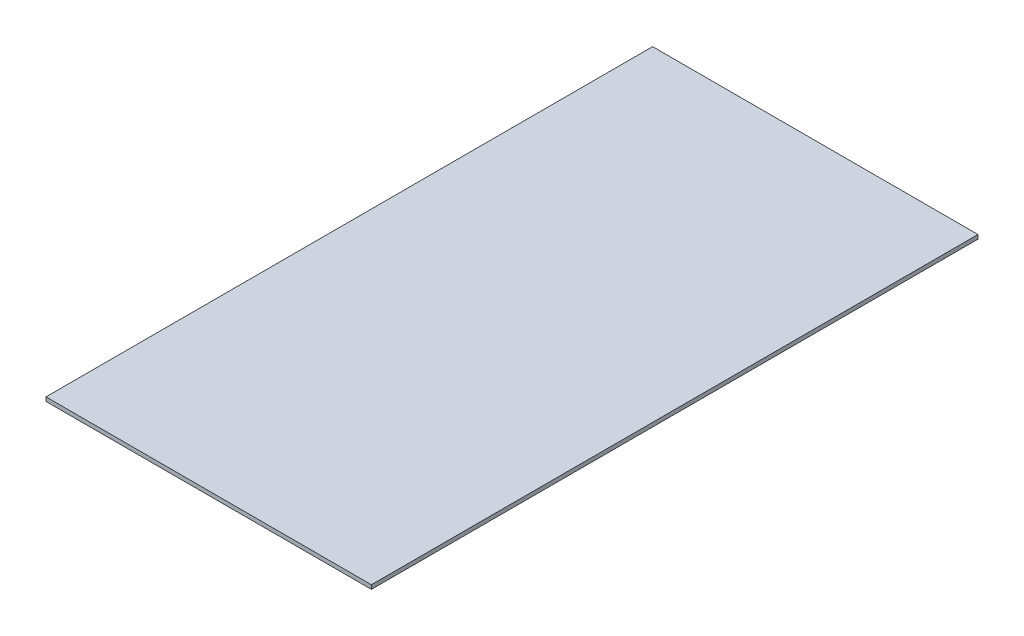
ISO-10303-21;
HEADER;
FILE_DESCRIPTION(('STEP AP214'),'2;1');
FILE_NAME('part.step','',(''),(''),'','','');
FILE_SCHEMA(('AUTOMOTIVE_DESIGN { 1 0 10303 214 1 1 1 1 }'));
ENDSEC;
DATA;
#1=APPLICATION_CONTEXT('core data for automotive mechanical design processes');
#2=APPLICATION_PROTOCOL_DEFINITION('international standard','automotive_design',2000,#1);
#3=PRODUCT_CONTEXT('',#1,'mechanical');
#4=PRODUCT('Part','Part','',(#3));
#5=PRODUCT_RELATED_PRODUCT_CATEGORY('part','',(#4));
#6=PRODUCT_DEFINITION_FORMATION('','',#4);
#7=PRODUCT_DEFINITION_CONTEXT('part definition',#1,'design');
#8=PRODUCT_DEFINITION('design','',#6,#7);
#9=PRODUCT_DEFINITION_SHAPE('','',#8);
#10=(LENGTH_UNIT() NAMED_UNIT(*) SI_UNIT(.MILLI.,.METRE.));
#11=(NAMED_UNIT(*) PLANE_ANGLE_UNIT() SI_UNIT($,.RADIAN.));
#12=(NAMED_UNIT(*) SI_UNIT($,.STERADIAN.) SOLID_ANGLE_UNIT());
#13=UNCERTAINTY_MEASURE_WITH_UNIT(LENGTH_MEASURE(1.E-05),#10,'distance_accuracy_value','');
#14=(GEOMETRIC_REPRESENTATION_CONTEXT(3) GLOBAL_UNCERTAINTY_ASSIGNED_CONTEXT((#13)) GLOBAL_UNIT_ASSIGNED_CONTEXT((#10,
#11,#12)) REPRESENTATION_CONTEXT('',''));
#15=CARTESIAN_POINT('',(0.,0.,0.));
#16=DIRECTION('',(0.,0.,1.));
#17=DIRECTION('',(1.,0.,0.));
#18=AXIS2_PLACEMENT_3D('',#15,#16,#17);
#19=CARTESIAN_POINT('',(0.,12.7,0.));
#20=DIRECTION('',(1.,0.,0.));
#21=DIRECTION('',(0.,0.,-1.));
#22=AXIS2_PLACEMENT_3D('',#19,#20,#21);
#23=PLANE('',#22);
#24=DIRECTION('',(0.,0.,1.));
#25=VECTOR('',#24,1.);
#26=CARTESIAN_POINT('',(0.,0.,0.));
#27=LINE('',#26,#25);
#28=CARTESIAN_POINT('',(0.,0.,-1917.7));
#29=VERTEX_POINT('',#28);
#30=CARTESIAN_POINT('',(0.,0.,0.));
#31=VERTEX_POINT('',#30);
#32=EDGE_CURVE('E95',#29,#31,#27,.T.);
#33=ORIENTED_EDGE('',*,*,#32,.T.);
#34=DIRECTION('',(0.,-1.,0.));
#35=VECTOR('',#34,1.);
#36=CARTESIAN_POINT('',(0.,12.7,0.));
#37=LINE('',#36,#35);
#38=CARTESIAN_POINT('',(0.,12.7,0.));
#39=VERTEX_POINT('',#38);
#40=EDGE_CURVE('E11',#39,#31,#37,.T.);
#41=ORIENTED_EDGE('',*,*,#40,.F.);
#42=DIRECTION('',(0.,0.,1.));
#43=VECTOR('',#42,1.);
#44=CARTESIAN_POINT('',(0.,12.7,0.));
#45=LINE('',#44,#43);
#46=CARTESIAN_POINT('',(0.,12.7,-1917.7));
#47=VERTEX_POINT('',#46);
#48=EDGE_CURVE('E83',#47,#39,#45,.T.);
#49=ORIENTED_EDGE('',*,*,#48,.F.);
#50=DIRECTION('',(0.,-1.,0.));
#51=VECTOR('',#50,1.);
#52=CARTESIAN_POINT('',(0.,12.7,-1917.7));
#53=LINE('',#52,#51);
#54=EDGE_CURVE('E91',#47,#29,#53,.T.);
#55=ORIENTED_EDGE('',*,*,#54,.T.);
#56=EDGE_LOOP('',(#33,#41,#49,#55));
#57=FACE_BOUND('',#56,.T.);
#58=ADVANCED_FACE('F32',(#57),#23,.F.);
#59=CARTESIAN_POINT('',(0.,12.7,0.));
#60=DIRECTION('',(0.,0.,-1.));
#61=DIRECTION('',(-1.,0.,0.));
#62=AXIS2_PLACEMENT_3D('',#59,#60,#61);
#63=PLANE('',#62);
#64=DIRECTION('',(1.,0.,0.));
#65=VECTOR('',#64,1.);
#66=CARTESIAN_POINT('',(0.,0.,0.));
#67=LINE('',#66,#65);
#68=CARTESIAN_POINT('',(1028.7,0.,0.));
#69=VERTEX_POINT('',#68);
#70=EDGE_CURVE('E87',#31,#69,#67,.T.);
#71=ORIENTED_EDGE('',*,*,#70,.T.);
#72=DIRECTION('',(0.,-1.,0.));
#73=VECTOR('',#72,1.);
#74=CARTESIAN_POINT('',(1028.7,12.7,0.));
#75=LINE('',#74,#73);
#76=CARTESIAN_POINT('',(1028.7,12.7,0.));
#77=VERTEX_POINT('',#76);
#78=EDGE_CURVE('E40',#77,#69,#75,.T.);
#79=ORIENTED_EDGE('',*,*,#78,.F.);
#80=DIRECTION('',(1.,0.,0.));
#81=VECTOR('',#80,1.);
#82=CARTESIAN_POINT('',(0.,12.7,0.));
#83=LINE('',#82,#81);
#84=EDGE_CURVE('E78',#39,#77,#83,.T.);
#85=ORIENTED_EDGE('',*,*,#84,.F.);
#86=ORIENTED_EDGE('',*,*,#40,.T.);
#87=EDGE_LOOP('',(#71,#79,#85,#86));
#88=FACE_BOUND('',#87,.T.);
#89=ADVANCED_FACE('F86',(#88),#63,.F.);
#90=CARTESIAN_POINT('',(1028.7,12.7,0.));
#91=DIRECTION('',(-1.,0.,0.));
#92=DIRECTION('',(0.,0.,1.));
#93=AXIS2_PLACEMENT_3D('',#90,#91,#92);
#94=PLANE('',#93);
#95=DIRECTION('',(0.,0.,-1.));
#96=VECTOR('',#95,1.);
#97=CARTESIAN_POINT('',(1028.7,0.,0.));
#98=LINE('',#97,#96);
#99=CARTESIAN_POINT('',(1028.7,0.,-1917.7));
#100=VERTEX_POINT('',#99);
#101=EDGE_CURVE('E65',#69,#100,#98,.T.);
#102=ORIENTED_EDGE('',*,*,#101,.T.);
#103=DIRECTION('',(0.,-1.,0.));
#104=VECTOR('',#103,1.);
#105=CARTESIAN_POINT('',(1028.7,12.7,-1917.7));
#106=LINE('',#105,#104);
#107=CARTESIAN_POINT('',(1028.7,12.7,-1917.7));
#108=VERTEX_POINT('',#107);
#109=EDGE_CURVE('E88',#108,#100,#106,.T.);
#110=ORIENTED_EDGE('',*,*,#109,.F.);
#111=DIRECTION('',(0.,0.,-1.));
#112=VECTOR('',#111,1.);
#113=CARTESIAN_POINT('',(1028.7,12.7,0.));
#114=LINE('',#113,#112);
#115=EDGE_CURVE('E81',#77,#108,#114,.T.);
#116=ORIENTED_EDGE('',*,*,#115,.F.);
#117=ORIENTED_EDGE('',*,*,#78,.T.);
#118=EDGE_LOOP('',(#102,#110,#116,#117));
#119=FACE_BOUND('',#118,.T.);
#120=ADVANCED_FACE('F89',(#119),#94,.F.);
#121=CARTESIAN_POINT('',(0.,12.7,-1917.7));
#122=DIRECTION('',(0.,0.,1.));
#123=DIRECTION('',(1.,0.,0.));
#124=AXIS2_PLACEMENT_3D('',#121,#122,#123);
#125=PLANE('',#124);
#126=DIRECTION('',(-1.,0.,0.));
#127=VECTOR('',#126,1.);
#128=CARTESIAN_POINT('',(0.,0.,-1917.7));
#129=LINE('',#128,#127);
#130=EDGE_CURVE('E71',#100,#29,#129,.T.);
#131=ORIENTED_EDGE('',*,*,#130,.T.);
#132=ORIENTED_EDGE('',*,*,#54,.F.);
#133=DIRECTION('',(-1.,0.,0.));
#134=VECTOR('',#133,1.);
#135=CARTESIAN_POINT('',(0.,12.7,-1917.7));
#136=LINE('',#135,#134);
#137=EDGE_CURVE('E48',#108,#47,#136,.T.);
#138=ORIENTED_EDGE('',*,*,#137,.F.);
#139=ORIENTED_EDGE('',*,*,#109,.T.);
#140=EDGE_LOOP('',(#131,#132,#138,#139));
#141=FACE_BOUND('',#140,.T.);
#142=ADVANCED_FACE('F102',(#141),#125,.F.);
#143=CARTESIAN_POINT('',(0.,12.7,0.));
#144=DIRECTION('',(0.,-1.,0.));
#145=DIRECTION('',(0.,0.,-1.));
#146=AXIS2_PLACEMENT_3D('',#143,#144,#145);
#147=PLANE('',#146);
#148=ORIENTED_EDGE('',*,*,#48,.T.);
#149=ORIENTED_EDGE('',*,*,#84,.T.);
#150=ORIENTED_EDGE('',*,*,#115,.T.);
#151=ORIENTED_EDGE('',*,*,#137,.T.);
#152=EDGE_LOOP('',(#148,#149,#150,#151));
#153=FACE_BOUND('',#152,.T.);
#154=ADVANCED_FACE('F79',(#153),#147,.F.);
#155=CARTESIAN_POINT('',(0.,0.,0.));
#156=DIRECTION('',(0.,-1.,0.));
#157=DIRECTION('',(0.,0.,-1.));
#158=AXIS2_PLACEMENT_3D('',#155,#156,#157);
#159=PLANE('',#158);
#160=ORIENTED_EDGE('',*,*,#32,.F.);
#161=ORIENTED_EDGE('',*,*,#130,.F.);
#162=ORIENTED_EDGE('',*,*,#101,.F.);
#163=ORIENTED_EDGE('',*,*,#70,.F.);
#164=EDGE_LOOP('',(#160,#161,#162,#163));
#165=FACE_BOUND('',#164,.T.);
#166=ADVANCED_FACE('F105',(#165),#159,.T.);
#167=CLOSED_SHELL('',(#58,#89,#120,#142,#154,#166));
#168=MANIFOLD_SOLID_BREP('B2',#167);
#169=ADVANCED_BREP_SHAPE_REPRESENTATION('',(#18,#168),#14);
#170=SHAPE_DEFINITION_REPRESENTATION(#9,#169);
ENDSEC;
END-ISO-10303-21;
